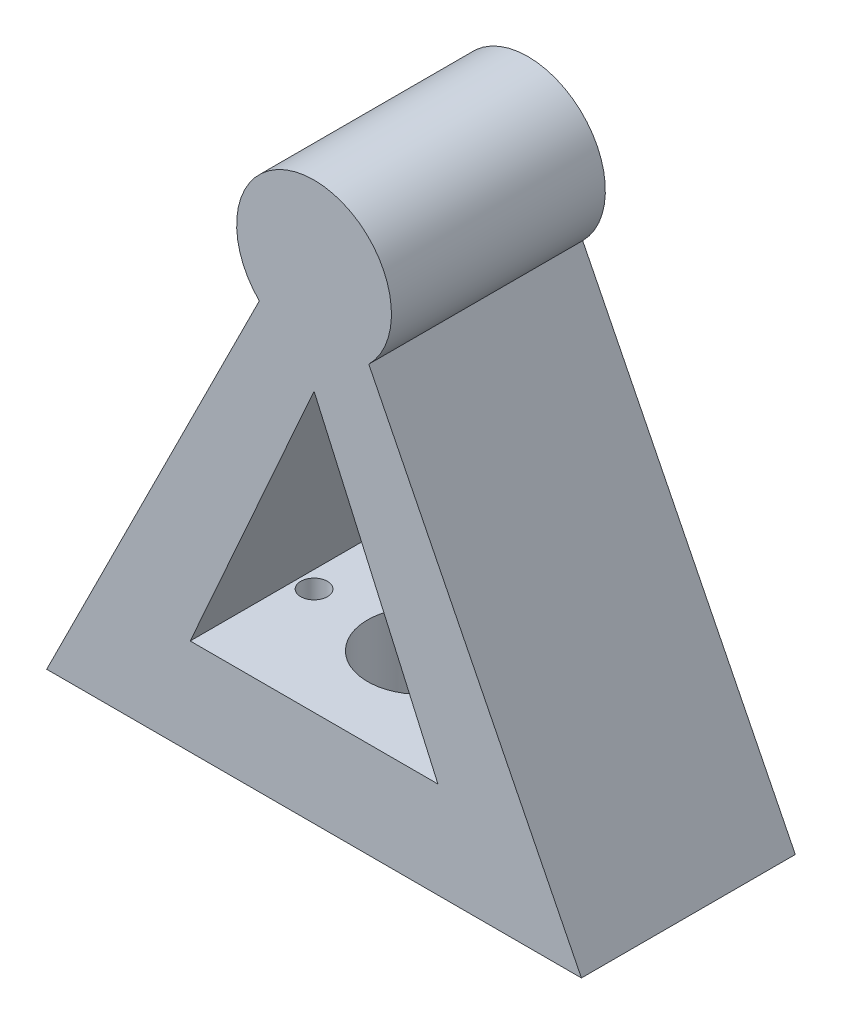
ISO-10303-21;
HEADER;
FILE_DESCRIPTION(('STEP AP214'),'2;1');
FILE_NAME('part.step','',(''),(''),'','','');
FILE_SCHEMA(('AUTOMOTIVE_DESIGN { 1 0 10303 214 1 1 1 1 }'));
ENDSEC;
DATA;
#1=APPLICATION_CONTEXT('core data for automotive mechanical design processes');
#2=APPLICATION_PROTOCOL_DEFINITION('international standard','automotive_design',2000,#1);
#3=PRODUCT_CONTEXT('',#1,'mechanical');
#4=PRODUCT('Part','Part','',(#3));
#5=PRODUCT_RELATED_PRODUCT_CATEGORY('part','',(#4));
#6=PRODUCT_DEFINITION_FORMATION('','',#4);
#7=PRODUCT_DEFINITION_CONTEXT('part definition',#1,'design');
#8=PRODUCT_DEFINITION('design','',#6,#7);
#9=PRODUCT_DEFINITION_SHAPE('','',#8);
#10=(LENGTH_UNIT() NAMED_UNIT(*) SI_UNIT(.MILLI.,.METRE.));
#11=(NAMED_UNIT(*) PLANE_ANGLE_UNIT() SI_UNIT($,.RADIAN.));
#12=(NAMED_UNIT(*) SI_UNIT($,.STERADIAN.) SOLID_ANGLE_UNIT());
#13=UNCERTAINTY_MEASURE_WITH_UNIT(LENGTH_MEASURE(1.E-05),#10,'distance_accuracy_value','');
#14=(GEOMETRIC_REPRESENTATION_CONTEXT(3) GLOBAL_UNCERTAINTY_ASSIGNED_CONTEXT((#13)) GLOBAL_UNIT_ASSIGNED_CONTEXT((#10,
#11,#12)) REPRESENTATION_CONTEXT('',''));
#15=CARTESIAN_POINT('',(0.,0.,0.));
#16=DIRECTION('',(0.,0.,1.));
#17=DIRECTION('',(1.,0.,0.));
#18=AXIS2_PLACEMENT_3D('',#15,#16,#17);
#19=CARTESIAN_POINT('',(12.8951122830522,5.11765145686942,20.));
#20=DIRECTION('',(0.,0.,-1.));
#21=DIRECTION('',(-1.,0.,0.));
#22=AXIS2_PLACEMENT_3D('',#19,#20,#21);
#23=PLANE('',#22);
#24=DIRECTION('',(-0.447213595499958,0.894427190999916,0.));
#25=VECTOR('',#24,1.);
#26=CARTESIAN_POINT('',(18.0127637399216,0.,20.));
#27=LINE('',#26,#25);
#28=CARTESIAN_POINT('',(37.8951122830522,-39.7646970862612,20.));
#29=VERTEX_POINT('',#28);
#30=CARTESIAN_POINT('',(18.0127637399216,0.,20.));
#31=VERTEX_POINT('',#30);
#32=EDGE_CURVE('E119',#29,#31,#27,.T.);
#33=ORIENTED_EDGE('',*,*,#32,.T.);
#34=CARTESIAN_POINT('',(12.8951122830522,5.11765145686942,20.));
#35=DIRECTION('',(0.,0.,1.));
#36=DIRECTION('',(-1.,0.,0.));
#37=AXIS2_PLACEMENT_3D('',#34,#35,#36);
#38=CIRCLE('',#37,7.23745209780315);
#39=CARTESIAN_POINT('',(7.77746082618275,0.,20.));
#40=VERTEX_POINT('',#39);
#41=EDGE_CURVE('E122',#31,#40,#38,.T.);
#42=ORIENTED_EDGE('',*,*,#41,.T.);
#43=DIRECTION('',(-0.447213595499958,-0.894427190999916,0.));
#44=VECTOR('',#43,1.);
#45=CARTESIAN_POINT('',(-12.1048877169478,-39.7646970862612,20.));
#46=LINE('',#45,#44);
#47=CARTESIAN_POINT('',(-12.1048877169478,-39.7646970862612,20.));
#48=VERTEX_POINT('',#47);
#49=EDGE_CURVE('E125',#40,#48,#46,.T.);
#50=ORIENTED_EDGE('',*,*,#49,.T.);
#51=DIRECTION('',(1.,0.,0.));
#52=VECTOR('',#51,1.);
#53=CARTESIAN_POINT('',(-12.1048877169478,-39.7646970862612,20.));
#54=LINE('',#53,#52);
#55=EDGE_CURVE('E127',#48,#29,#54,.T.);
#56=ORIENTED_EDGE('',*,*,#55,.T.);
#57=EDGE_LOOP('',(#33,#42,#50,#56));
#58=FACE_BOUND('',#57,.T.);
#59=DIRECTION('',(-0.406635472400899,0.91359049501694,0.));
#60=VECTOR('',#59,1.);
#61=CARTESIAN_POINT('',(12.8951122830522,-4.74634711351262,20.));
#62=LINE('',#61,#60);
#63=CARTESIAN_POINT('',(24.4757757093549,-30.7646970862612,20.));
#64=VERTEX_POINT('',#63);
#65=CARTESIAN_POINT('',(12.8951122830522,-4.74634711351262,20.));
#66=VERTEX_POINT('',#65);
#67=EDGE_CURVE('E94',#64,#66,#62,.T.);
#68=ORIENTED_EDGE('',*,*,#67,.F.);
#69=DIRECTION('',(1.,0.,0.));
#70=VECTOR('',#69,1.);
#71=CARTESIAN_POINT('',(14.6295515095591,-30.7646970862612,20.));
#72=LINE('',#71,#70);
#73=CARTESIAN_POINT('',(1.31444885674938,-30.7646970862612,20.));
#74=VERTEX_POINT('',#73);
#75=EDGE_CURVE('E89',#74,#64,#72,.T.);
#76=ORIENTED_EDGE('',*,*,#75,.F.);
#77=DIRECTION('',(-0.406635472400899,-0.91359049501694,0.));
#78=VECTOR('',#77,1.);
#79=CARTESIAN_POINT('',(1.31444885674938,-30.7646970862612,20.));
#80=LINE('',#79,#78);
#81=EDGE_CURVE('E106',#66,#74,#80,.T.);
#82=ORIENTED_EDGE('',*,*,#81,.F.);
#83=EDGE_LOOP('',(#68,#76,#82));
#84=FACE_BOUND('',#83,.T.);
#85=ADVANCED_FACE('F33',(#58,#84),#23,.F.);
#86=CARTESIAN_POINT('',(12.8951122830522,5.11765145686942,0.));
#87=DIRECTION('',(0.,0.,-1.));
#88=DIRECTION('',(-1.,0.,0.));
#89=AXIS2_PLACEMENT_3D('',#86,#87,#88);
#90=PLANE('',#89);
#91=DIRECTION('',(-0.447213595499958,0.894427190999916,0.));
#92=VECTOR('',#91,1.);
#93=CARTESIAN_POINT('',(18.0127637399216,0.,0.));
#94=LINE('',#93,#92);
#95=CARTESIAN_POINT('',(37.8951122830522,-39.7646970862612,0.));
#96=VERTEX_POINT('',#95);
#97=CARTESIAN_POINT('',(18.0127637399216,0.,0.));
#98=VERTEX_POINT('',#97);
#99=EDGE_CURVE('E103',#96,#98,#94,.T.);
#100=ORIENTED_EDGE('',*,*,#99,.F.);
#101=DIRECTION('',(1.,0.,0.));
#102=VECTOR('',#101,1.);
#103=CARTESIAN_POINT('',(-12.1048877169478,-39.7646970862612,0.));
#104=LINE('',#103,#102);
#105=CARTESIAN_POINT('',(-12.1048877169478,-39.7646970862612,0.));
#106=VERTEX_POINT('',#105);
#107=EDGE_CURVE('E123',#106,#96,#104,.T.);
#108=ORIENTED_EDGE('',*,*,#107,.F.);
#109=DIRECTION('',(-0.447213595499958,-0.894427190999916,0.));
#110=VECTOR('',#109,1.);
#111=CARTESIAN_POINT('',(-12.1048877169478,-39.7646970862612,0.));
#112=LINE('',#111,#110);
#113=CARTESIAN_POINT('',(7.77746082618275,0.,0.));
#114=VERTEX_POINT('',#113);
#115=EDGE_CURVE('E134',#114,#106,#112,.T.);
#116=ORIENTED_EDGE('',*,*,#115,.F.);
#117=CARTESIAN_POINT('',(12.8951122830522,5.11765145686942,0.));
#118=DIRECTION('',(0.,0.,1.));
#119=DIRECTION('',(-1.,0.,0.));
#120=AXIS2_PLACEMENT_3D('',#117,#118,#119);
#121=CIRCLE('',#120,7.23745209780315);
#122=EDGE_CURVE('E132',#98,#114,#121,.T.);
#123=ORIENTED_EDGE('',*,*,#122,.F.);
#124=EDGE_LOOP('',(#100,#108,#116,#123));
#125=FACE_BOUND('',#124,.T.);
#126=DIRECTION('',(1.,0.,0.));
#127=VECTOR('',#126,1.);
#128=CARTESIAN_POINT('',(14.6295515095591,-30.7646970862612,0.));
#129=LINE('',#128,#127);
#130=CARTESIAN_POINT('',(1.31444885674938,-30.7646970862612,0.));
#131=VERTEX_POINT('',#130);
#132=CARTESIAN_POINT('',(24.4757757093549,-30.7646970862612,0.));
#133=VERTEX_POINT('',#132);
#134=EDGE_CURVE('E95',#131,#133,#129,.T.);
#135=ORIENTED_EDGE('',*,*,#134,.T.);
#136=DIRECTION('',(-0.406635472400899,0.91359049501694,0.));
#137=VECTOR('',#136,1.);
#138=CARTESIAN_POINT('',(12.8951122830522,-4.74634711351262,0.));
#139=LINE('',#138,#137);
#140=CARTESIAN_POINT('',(12.8951122830522,-4.74634711351262,0.));
#141=VERTEX_POINT('',#140);
#142=EDGE_CURVE('E101',#133,#141,#139,.T.);
#143=ORIENTED_EDGE('',*,*,#142,.T.);
#144=DIRECTION('',(-0.406635472400899,-0.91359049501694,0.));
#145=VECTOR('',#144,1.);
#146=CARTESIAN_POINT('',(1.31444885674938,-30.7646970862612,0.));
#147=LINE('',#146,#145);
#148=EDGE_CURVE('E112',#141,#131,#147,.T.);
#149=ORIENTED_EDGE('',*,*,#148,.T.);
#150=EDGE_LOOP('',(#135,#143,#149));
#151=FACE_BOUND('',#150,.T.);
#152=ADVANCED_FACE('F152',(#125,#151),#90,.T.);
#153=CARTESIAN_POINT('',(18.0127637399216,0.,20.));
#154=DIRECTION('',(-0.894427190999916,-0.447213595499958,0.));
#155=DIRECTION('',(0.447213595499958,-0.894427190999916,0.));
#156=AXIS2_PLACEMENT_3D('',#153,#154,#155);
#157=PLANE('',#156);
#158=ORIENTED_EDGE('',*,*,#99,.T.);
#159=DIRECTION('',(0.,0.,-1.));
#160=VECTOR('',#159,1.);
#161=CARTESIAN_POINT('',(18.0127637399216,0.,20.));
#162=LINE('',#161,#160);
#163=EDGE_CURVE('E11',#31,#98,#162,.T.);
#164=ORIENTED_EDGE('',*,*,#163,.F.);
#165=ORIENTED_EDGE('',*,*,#32,.F.);
#166=DIRECTION('',(0.,0.,-1.));
#167=VECTOR('',#166,1.);
#168=CARTESIAN_POINT('',(37.8951122830522,-39.7646970862612,20.));
#169=LINE('',#168,#167);
#170=EDGE_CURVE('E129',#29,#96,#169,.T.);
#171=ORIENTED_EDGE('',*,*,#170,.T.);
#172=EDGE_LOOP('',(#158,#164,#165,#171));
#173=FACE_BOUND('',#172,.T.);
#174=ADVANCED_FACE('F35',(#173),#157,.F.);
#175=CARTESIAN_POINT('',(12.8951122830522,5.11765145686942,20.));
#176=DIRECTION('',(0.,0.,-1.));
#177=DIRECTION('',(-1.,0.,0.));
#178=AXIS2_PLACEMENT_3D('',#175,#176,#177);
#179=CYLINDRICAL_SURFACE('',#178,7.23745209780315);
#180=ORIENTED_EDGE('',*,*,#122,.T.);
#181=DIRECTION('',(0.,0.,-1.));
#182=VECTOR('',#181,1.);
#183=CARTESIAN_POINT('',(7.77746082618275,0.,20.));
#184=LINE('',#183,#182);
#185=EDGE_CURVE('E41',#40,#114,#184,.T.);
#186=ORIENTED_EDGE('',*,*,#185,.F.);
#187=ORIENTED_EDGE('',*,*,#41,.F.);
#188=ORIENTED_EDGE('',*,*,#163,.T.);
#189=EDGE_LOOP('',(#180,#186,#187,#188));
#190=FACE_BOUND('',#189,.T.);
#191=ADVANCED_FACE('F162',(#190),#179,.T.);
#192=CARTESIAN_POINT('',(-12.1048877169478,-39.7646970862612,20.));
#193=DIRECTION('',(0.894427190999916,-0.447213595499958,0.));
#194=DIRECTION('',(0.447213595499958,0.894427190999916,0.));
#195=AXIS2_PLACEMENT_3D('',#192,#193,#194);
#196=PLANE('',#195);
#197=ORIENTED_EDGE('',*,*,#115,.T.);
#198=DIRECTION('',(0.,0.,-1.));
#199=VECTOR('',#198,1.);
#200=CARTESIAN_POINT('',(-12.1048877169478,-39.7646970862612,20.));
#201=LINE('',#200,#199);
#202=EDGE_CURVE('E139',#48,#106,#201,.T.);
#203=ORIENTED_EDGE('',*,*,#202,.F.);
#204=ORIENTED_EDGE('',*,*,#49,.F.);
#205=ORIENTED_EDGE('',*,*,#185,.T.);
#206=EDGE_LOOP('',(#197,#203,#204,#205));
#207=FACE_BOUND('',#206,.T.);
#208=ADVANCED_FACE('F146',(#207),#196,.F.);
#209=CARTESIAN_POINT('',(-12.1048877169478,-39.7646970862612,20.));
#210=DIRECTION('',(0.,1.,0.));
#211=DIRECTION('',(0.,0.,1.));
#212=AXIS2_PLACEMENT_3D('',#209,#210,#211);
#213=PLANE('',#212);
#214=CARTESIAN_POINT('',(22.8951122830522,-39.7646970862612,10.));
#215=DIRECTION('',(0.,-1.,0.));
#216=DIRECTION('',(0.,0.,-1.));
#217=AXIS2_PLACEMENT_3D('',#214,#215,#216);
#218=CIRCLE('',#217,1.25);
#219=CARTESIAN_POINT('',(22.8951122830522,-39.7646970862612,8.75));
#220=VERTEX_POINT('',#219);
#221=EDGE_CURVE('E187',#220,#220,#218,.T.);
#222=ORIENTED_EDGE('',*,*,#221,.F.);
#223=EDGE_LOOP('',(#222));
#224=FACE_BOUND('',#223,.T.);
#225=CARTESIAN_POINT('',(12.8951122830521,-39.7646970862612,10.));
#226=DIRECTION('',(0.,-1.,0.));
#227=DIRECTION('',(0.,0.,-1.));
#228=AXIS2_PLACEMENT_3D('',#225,#226,#227);
#229=CIRCLE('',#228,5.);
#230=CARTESIAN_POINT('',(12.8951122830521,-39.7646970862612,5.));
#231=VERTEX_POINT('',#230);
#232=EDGE_CURVE('E191',#231,#231,#229,.T.);
#233=ORIENTED_EDGE('',*,*,#232,.F.);
#234=EDGE_LOOP('',(#233));
#235=FACE_BOUND('',#234,.T.);
#236=CARTESIAN_POINT('',(2.89511228305214,-39.7646970862612,10.));
#237=DIRECTION('',(0.,-1.,0.));
#238=DIRECTION('',(0.,0.,-1.));
#239=AXIS2_PLACEMENT_3D('',#236,#237,#238);
#240=CIRCLE('',#239,1.25);
#241=CARTESIAN_POINT('',(2.89511228305214,-39.7646970862612,8.75));
#242=VERTEX_POINT('',#241);
#243=EDGE_CURVE('E194',#242,#242,#240,.T.);
#244=ORIENTED_EDGE('',*,*,#243,.F.);
#245=EDGE_LOOP('',(#244));
#246=FACE_BOUND('',#245,.T.);
#247=ORIENTED_EDGE('',*,*,#107,.T.);
#248=ORIENTED_EDGE('',*,*,#170,.F.);
#249=ORIENTED_EDGE('',*,*,#55,.F.);
#250=ORIENTED_EDGE('',*,*,#202,.T.);
#251=EDGE_LOOP('',(#247,#248,#249,#250));
#252=FACE_BOUND('',#251,.T.);
#253=ADVANCED_FACE('F156',(#224,#235,#246,#252),#213,.F.);
#254=CARTESIAN_POINT('',(12.8951122830522,-4.74634711351262,20.));
#255=DIRECTION('',(-0.91359049501694,-0.406635472400899,0.));
#256=DIRECTION('',(0.406635472400899,-0.91359049501694,0.));
#257=AXIS2_PLACEMENT_3D('',#254,#255,#256);
#258=PLANE('',#257);
#259=ORIENTED_EDGE('',*,*,#142,.F.);
#260=DIRECTION('',(0.,0.,-1.));
#261=VECTOR('',#260,1.);
#262=CARTESIAN_POINT('',(24.4757757093549,-30.7646970862612,20.));
#263=LINE('',#262,#261);
#264=EDGE_CURVE('E53',#64,#133,#263,.T.);
#265=ORIENTED_EDGE('',*,*,#264,.F.);
#266=ORIENTED_EDGE('',*,*,#67,.T.);
#267=DIRECTION('',(0.,0.,-1.));
#268=VECTOR('',#267,1.);
#269=CARTESIAN_POINT('',(12.8951122830522,-4.74634711351262,20.));
#270=LINE('',#269,#268);
#271=EDGE_CURVE('E104',#66,#141,#270,.T.);
#272=ORIENTED_EDGE('',*,*,#271,.T.);
#273=EDGE_LOOP('',(#259,#265,#266,#272));
#274=FACE_BOUND('',#273,.T.);
#275=ADVANCED_FACE('F98',(#274),#258,.T.);
#276=CARTESIAN_POINT('',(1.31444885674938,-30.7646970862612,20.));
#277=DIRECTION('',(0.91359049501694,-0.406635472400899,0.));
#278=DIRECTION('',(0.406635472400899,0.91359049501694,0.));
#279=AXIS2_PLACEMENT_3D('',#276,#277,#278);
#280=PLANE('',#279);
#281=ORIENTED_EDGE('',*,*,#148,.F.);
#282=ORIENTED_EDGE('',*,*,#271,.F.);
#283=ORIENTED_EDGE('',*,*,#81,.T.);
#284=DIRECTION('',(0.,0.,-1.));
#285=VECTOR('',#284,1.);
#286=CARTESIAN_POINT('',(1.31444885674938,-30.7646970862612,20.));
#287=LINE('',#286,#285);
#288=EDGE_CURVE('E48',#74,#131,#287,.T.);
#289=ORIENTED_EDGE('',*,*,#288,.T.);
#290=EDGE_LOOP('',(#281,#282,#283,#289));
#291=FACE_BOUND('',#290,.T.);
#292=ADVANCED_FACE('F183',(#291),#280,.T.);
#293=CARTESIAN_POINT('',(14.6295515095591,-30.7646970862612,20.));
#294=DIRECTION('',(0.,1.,0.));
#295=DIRECTION('',(0.,0.,1.));
#296=AXIS2_PLACEMENT_3D('',#293,#294,#295);
#297=PLANE('',#296);
#298=CARTESIAN_POINT('',(22.8951122830522,-30.7646970862612,10.));
#299=DIRECTION('',(0.,-1.,0.));
#300=DIRECTION('',(0.,0.,-1.));
#301=AXIS2_PLACEMENT_3D('',#298,#299,#300);
#302=CIRCLE('',#301,1.25);
#303=CARTESIAN_POINT('',(22.8951122830522,-30.7646970862612,8.75));
#304=VERTEX_POINT('',#303);
#305=EDGE_CURVE('E202',#304,#304,#302,.T.);
#306=ORIENTED_EDGE('',*,*,#305,.T.);
#307=EDGE_LOOP('',(#306));
#308=FACE_BOUND('',#307,.T.);
#309=CARTESIAN_POINT('',(12.8951122830521,-30.7646970862612,10.));
#310=DIRECTION('',(0.,-1.,0.));
#311=DIRECTION('',(0.,0.,-1.));
#312=AXIS2_PLACEMENT_3D('',#309,#310,#311);
#313=CIRCLE('',#312,5.);
#314=CARTESIAN_POINT('',(12.8951122830521,-30.7646970862612,5.));
#315=VERTEX_POINT('',#314);
#316=EDGE_CURVE('E196',#315,#315,#313,.T.);
#317=ORIENTED_EDGE('',*,*,#316,.T.);
#318=EDGE_LOOP('',(#317));
#319=FACE_BOUND('',#318,.T.);
#320=CARTESIAN_POINT('',(2.89511228305214,-30.7646970862612,10.));
#321=DIRECTION('',(0.,-1.,0.));
#322=DIRECTION('',(0.,0.,-1.));
#323=AXIS2_PLACEMENT_3D('',#320,#321,#322);
#324=CIRCLE('',#323,1.25);
#325=CARTESIAN_POINT('',(2.89511228305214,-30.7646970862612,8.75));
#326=VERTEX_POINT('',#325);
#327=EDGE_CURVE('E113',#326,#326,#324,.T.);
#328=ORIENTED_EDGE('',*,*,#327,.T.);
#329=EDGE_LOOP('',(#328));
#330=FACE_BOUND('',#329,.T.);
#331=ORIENTED_EDGE('',*,*,#134,.F.);
#332=ORIENTED_EDGE('',*,*,#288,.F.);
#333=ORIENTED_EDGE('',*,*,#75,.T.);
#334=ORIENTED_EDGE('',*,*,#264,.T.);
#335=EDGE_LOOP('',(#331,#332,#333,#334));
#336=FACE_BOUND('',#335,.T.);
#337=ADVANCED_FACE('F90',(#308,#319,#330,#336),#297,.T.);
#338=CARTESIAN_POINT('',(2.89511228305214,-30.7646970862612,10.));
#339=DIRECTION('',(0.,-1.,0.));
#340=DIRECTION('',(0.,0.,-1.));
#341=AXIS2_PLACEMENT_3D('',#338,#339,#340);
#342=CYLINDRICAL_SURFACE('',#341,1.25);
#343=ORIENTED_EDGE('',*,*,#327,.F.);
#344=EDGE_LOOP('',(#343));
#345=FACE_BOUND('',#344,.T.);
#346=ORIENTED_EDGE('',*,*,#243,.T.);
#347=EDGE_LOOP('',(#346));
#348=FACE_BOUND('',#347,.T.);
#349=ADVANCED_FACE('F218',(#345,#348),#342,.F.);
#350=CARTESIAN_POINT('',(12.8951122830521,-30.7646970862612,10.));
#351=DIRECTION('',(0.,-1.,0.));
#352=DIRECTION('',(0.,0.,-1.));
#353=AXIS2_PLACEMENT_3D('',#350,#351,#352);
#354=CYLINDRICAL_SURFACE('',#353,5.);
#355=ORIENTED_EDGE('',*,*,#316,.F.);
#356=EDGE_LOOP('',(#355));
#357=FACE_BOUND('',#356,.T.);
#358=ORIENTED_EDGE('',*,*,#232,.T.);
#359=EDGE_LOOP('',(#358));
#360=FACE_BOUND('',#359,.T.);
#361=ADVANCED_FACE('F213',(#357,#360),#354,.F.);
#362=CARTESIAN_POINT('',(22.8951122830522,-30.7646970862612,10.));
#363=DIRECTION('',(0.,-1.,0.));
#364=DIRECTION('',(0.,0.,-1.));
#365=AXIS2_PLACEMENT_3D('',#362,#363,#364);
#366=CYLINDRICAL_SURFACE('',#365,1.25);
#367=ORIENTED_EDGE('',*,*,#305,.F.);
#368=EDGE_LOOP('',(#367));
#369=FACE_BOUND('',#368,.T.);
#370=ORIENTED_EDGE('',*,*,#221,.T.);
#371=EDGE_LOOP('',(#370));
#372=FACE_BOUND('',#371,.T.);
#373=ADVANCED_FACE('F210',(#369,#372),#366,.F.);
#374=CLOSED_SHELL('',(#85,#152,#174,#191,#208,#253,#275,#292,#337,#349,#361,#373));
#375=MANIFOLD_SOLID_BREP('B2',#374);
#376=ADVANCED_BREP_SHAPE_REPRESENTATION('',(#18,#375),#14);
#377=SHAPE_DEFINITION_REPRESENTATION(#9,#376);
ENDSEC;
END-ISO-10303-21;
